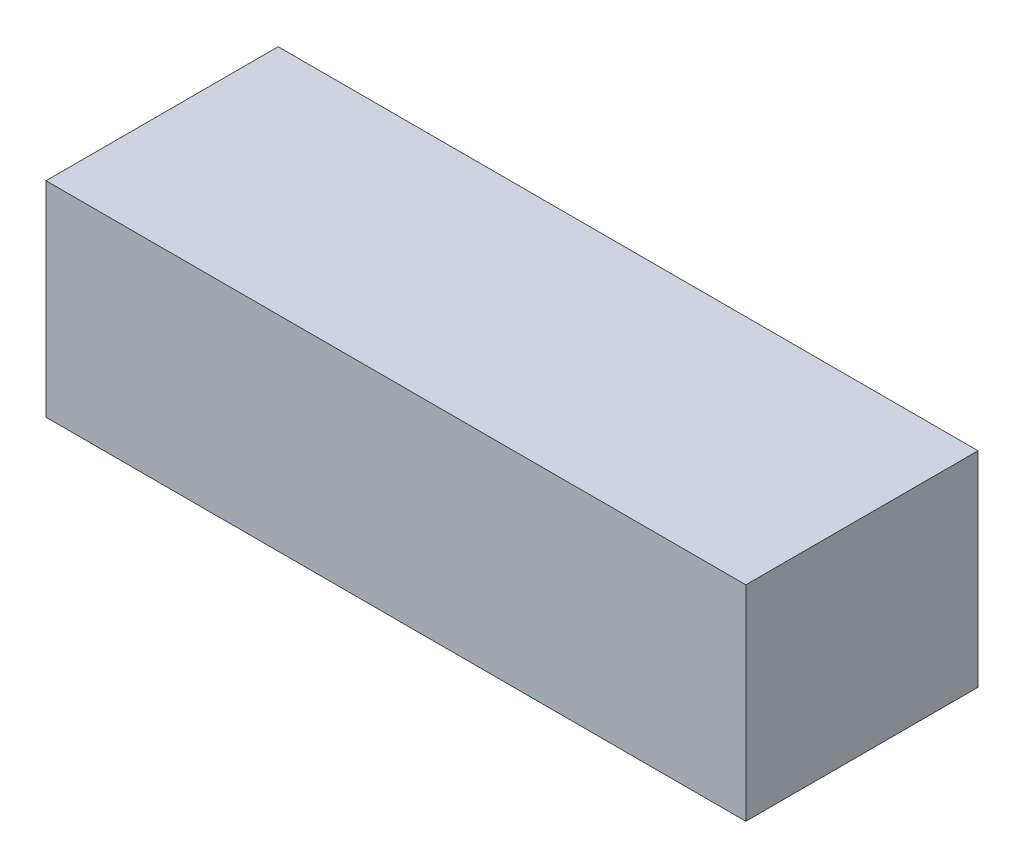
ISO-10303-21;
HEADER;
FILE_DESCRIPTION(('STEP AP214'),'2;1');
FILE_NAME('part.step','',(''),(''),'','','');
FILE_SCHEMA(('AUTOMOTIVE_DESIGN { 1 0 10303 214 1 1 1 1 }'));
ENDSEC;
DATA;
#1=APPLICATION_CONTEXT('core data for automotive mechanical design processes');
#2=APPLICATION_PROTOCOL_DEFINITION('international standard','automotive_design',2000,#1);
#3=PRODUCT_CONTEXT('',#1,'mechanical');
#4=PRODUCT('Part','Part','',(#3));
#5=PRODUCT_RELATED_PRODUCT_CATEGORY('part','',(#4));
#6=PRODUCT_DEFINITION_FORMATION('','',#4);
#7=PRODUCT_DEFINITION_CONTEXT('part definition',#1,'design');
#8=PRODUCT_DEFINITION('design','',#6,#7);
#9=PRODUCT_DEFINITION_SHAPE('','',#8);
#10=(LENGTH_UNIT() NAMED_UNIT(*) SI_UNIT(.MILLI.,.METRE.));
#11=(NAMED_UNIT(*) PLANE_ANGLE_UNIT() SI_UNIT($,.RADIAN.));
#12=(NAMED_UNIT(*) SI_UNIT($,.STERADIAN.) SOLID_ANGLE_UNIT());
#13=UNCERTAINTY_MEASURE_WITH_UNIT(LENGTH_MEASURE(1.E-05),#10,'distance_accuracy_value','');
#14=(GEOMETRIC_REPRESENTATION_CONTEXT(3) GLOBAL_UNCERTAINTY_ASSIGNED_CONTEXT((#13)) GLOBAL_UNIT_ASSIGNED_CONTEXT((#10,
#11,#12)) REPRESENTATION_CONTEXT('',''));
#15=CARTESIAN_POINT('',(0.,0.,0.));
#16=DIRECTION('',(0.,0.,1.));
#17=DIRECTION('',(1.,0.,0.));
#18=AXIS2_PLACEMENT_3D('',#15,#16,#17);
#19=CARTESIAN_POINT('',(51.25,30.,17.));
#20=DIRECTION('',(-1.,0.,0.));
#21=DIRECTION('',(0.,0.,1.));
#22=AXIS2_PLACEMENT_3D('',#19,#20,#21);
#23=PLANE('',#22);
#24=DIRECTION('',(0.,0.,-1.));
#25=VECTOR('',#24,1.);
#26=CARTESIAN_POINT('',(51.25,0.,17.));
#27=LINE('',#26,#25);
#28=CARTESIAN_POINT('',(51.25,0.,17.));
#29=VERTEX_POINT('',#28);
#30=CARTESIAN_POINT('',(51.25,0.,-17.));
#31=VERTEX_POINT('',#30);
#32=EDGE_CURVE('E102',#29,#31,#27,.T.);
#33=ORIENTED_EDGE('',*,*,#32,.T.);
#34=DIRECTION('',(0.,-1.,0.));
#35=VECTOR('',#34,1.);
#36=CARTESIAN_POINT('',(51.25,30.,-17.));
#37=LINE('',#36,#35);
#38=CARTESIAN_POINT('',(51.25,30.,-17.));
#39=VERTEX_POINT('',#38);
#40=EDGE_CURVE('E11',#39,#31,#37,.T.);
#41=ORIENTED_EDGE('',*,*,#40,.F.);
#42=DIRECTION('',(0.,0.,-1.));
#43=VECTOR('',#42,1.);
#44=CARTESIAN_POINT('',(51.25,30.,17.));
#45=LINE('',#44,#43);
#46=CARTESIAN_POINT('',(51.25,30.,17.));
#47=VERTEX_POINT('',#46);
#48=EDGE_CURVE('E90',#47,#39,#45,.T.);
#49=ORIENTED_EDGE('',*,*,#48,.F.);
#50=DIRECTION('',(0.,-1.,0.));
#51=VECTOR('',#50,1.);
#52=CARTESIAN_POINT('',(51.25,30.,17.));
#53=LINE('',#52,#51);
#54=EDGE_CURVE('E98',#47,#29,#53,.T.);
#55=ORIENTED_EDGE('',*,*,#54,.T.);
#56=EDGE_LOOP('',(#33,#41,#49,#55));
#57=FACE_BOUND('',#56,.T.);
#58=ADVANCED_FACE('F39',(#57),#23,.F.);
#59=CARTESIAN_POINT('',(-51.25,30.,-17.));
#60=DIRECTION('',(0.,0.,1.));
#61=DIRECTION('',(1.,0.,0.));
#62=AXIS2_PLACEMENT_3D('',#59,#60,#61);
#63=PLANE('',#62);
#64=DIRECTION('',(-1.,0.,0.));
#65=VECTOR('',#64,1.);
#66=CARTESIAN_POINT('',(-51.25,0.,-17.));
#67=LINE('',#66,#65);
#68=CARTESIAN_POINT('',(-51.25,0.,-17.));
#69=VERTEX_POINT('',#68);
#70=EDGE_CURVE('E94',#31,#69,#67,.T.);
#71=ORIENTED_EDGE('',*,*,#70,.T.);
#72=DIRECTION('',(0.,-1.,0.));
#73=VECTOR('',#72,1.);
#74=CARTESIAN_POINT('',(-51.25,30.,-17.));
#75=LINE('',#74,#73);
#76=CARTESIAN_POINT('',(-51.25,30.,-17.));
#77=VERTEX_POINT('',#76);
#78=EDGE_CURVE('E47',#77,#69,#75,.T.);
#79=ORIENTED_EDGE('',*,*,#78,.F.);
#80=DIRECTION('',(-1.,0.,0.));
#81=VECTOR('',#80,1.);
#82=CARTESIAN_POINT('',(-51.25,30.,-17.));
#83=LINE('',#82,#81);
#84=EDGE_CURVE('E85',#39,#77,#83,.T.);
#85=ORIENTED_EDGE('',*,*,#84,.F.);
#86=ORIENTED_EDGE('',*,*,#40,.T.);
#87=EDGE_LOOP('',(#71,#79,#85,#86));
#88=FACE_BOUND('',#87,.T.);
#89=ADVANCED_FACE('F93',(#88),#63,.F.);
#90=CARTESIAN_POINT('',(-51.25,30.,17.));
#91=DIRECTION('',(1.,0.,0.));
#92=DIRECTION('',(0.,0.,-1.));
#93=AXIS2_PLACEMENT_3D('',#90,#91,#92);
#94=PLANE('',#93);
#95=DIRECTION('',(0.,0.,1.));
#96=VECTOR('',#95,1.);
#97=CARTESIAN_POINT('',(-51.25,0.,17.));
#98=LINE('',#97,#96);
#99=CARTESIAN_POINT('',(-51.25,0.,17.));
#100=VERTEX_POINT('',#99);
#101=EDGE_CURVE('E72',#69,#100,#98,.T.);
#102=ORIENTED_EDGE('',*,*,#101,.T.);
#103=DIRECTION('',(0.,-1.,0.));
#104=VECTOR('',#103,1.);
#105=CARTESIAN_POINT('',(-51.25,30.,17.));
#106=LINE('',#105,#104);
#107=CARTESIAN_POINT('',(-51.25,30.,17.));
#108=VERTEX_POINT('',#107);
#109=EDGE_CURVE('E95',#108,#100,#106,.T.);
#110=ORIENTED_EDGE('',*,*,#109,.F.);
#111=DIRECTION('',(0.,0.,1.));
#112=VECTOR('',#111,1.);
#113=CARTESIAN_POINT('',(-51.25,30.,17.));
#114=LINE('',#113,#112);
#115=EDGE_CURVE('E88',#77,#108,#114,.T.);
#116=ORIENTED_EDGE('',*,*,#115,.F.);
#117=ORIENTED_EDGE('',*,*,#78,.T.);
#118=EDGE_LOOP('',(#102,#110,#116,#117));
#119=FACE_BOUND('',#118,.T.);
#120=ADVANCED_FACE('F96',(#119),#94,.F.);
#121=CARTESIAN_POINT('',(-51.25,30.,17.));
#122=DIRECTION('',(0.,0.,-1.));
#123=DIRECTION('',(-1.,0.,0.));
#124=AXIS2_PLACEMENT_3D('',#121,#122,#123);
#125=PLANE('',#124);
#126=DIRECTION('',(1.,0.,0.));
#127=VECTOR('',#126,1.);
#128=CARTESIAN_POINT('',(-51.25,0.,17.));
#129=LINE('',#128,#127);
#130=EDGE_CURVE('E78',#100,#29,#129,.T.);
#131=ORIENTED_EDGE('',*,*,#130,.T.);
#132=ORIENTED_EDGE('',*,*,#54,.F.);
#133=DIRECTION('',(1.,0.,0.));
#134=VECTOR('',#133,1.);
#135=CARTESIAN_POINT('',(-51.25,30.,17.));
#136=LINE('',#135,#134);
#137=EDGE_CURVE('E55',#108,#47,#136,.T.);
#138=ORIENTED_EDGE('',*,*,#137,.F.);
#139=ORIENTED_EDGE('',*,*,#109,.T.);
#140=EDGE_LOOP('',(#131,#132,#138,#139));
#141=FACE_BOUND('',#140,.T.);
#142=ADVANCED_FACE('F109',(#141),#125,.F.);
#143=CARTESIAN_POINT('',(0.,30.,0.));
#144=DIRECTION('',(0.,-1.,0.));
#145=DIRECTION('',(0.,0.,-1.));
#146=AXIS2_PLACEMENT_3D('',#143,#144,#145);
#147=PLANE('',#146);
#148=ORIENTED_EDGE('',*,*,#48,.T.);
#149=ORIENTED_EDGE('',*,*,#84,.T.);
#150=ORIENTED_EDGE('',*,*,#115,.T.);
#151=ORIENTED_EDGE('',*,*,#137,.T.);
#152=EDGE_LOOP('',(#148,#149,#150,#151));
#153=FACE_BOUND('',#152,.T.);
#154=ADVANCED_FACE('F86',(#153),#147,.F.);
#155=CARTESIAN_POINT('',(0.,0.,0.));
#156=DIRECTION('',(0.,-1.,0.));
#157=DIRECTION('',(0.,0.,-1.));
#158=AXIS2_PLACEMENT_3D('',#155,#156,#157);
#159=PLANE('',#158);
#160=ORIENTED_EDGE('',*,*,#32,.F.);
#161=ORIENTED_EDGE('',*,*,#130,.F.);
#162=ORIENTED_EDGE('',*,*,#101,.F.);
#163=ORIENTED_EDGE('',*,*,#70,.F.);
#164=EDGE_LOOP('',(#160,#161,#162,#163));
#165=FACE_BOUND('',#164,.T.);
#166=ADVANCED_FACE('F112',(#165),#159,.T.);
#167=CLOSED_SHELL('',(#58,#89,#120,#142,#154,#166));
#168=MANIFOLD_SOLID_BREP('B2',#167);
#169=ADVANCED_BREP_SHAPE_REPRESENTATION('',(#18,#168),#14);
#170=SHAPE_DEFINITION_REPRESENTATION(#9,#169);
ENDSEC;
END-ISO-10303-21;
